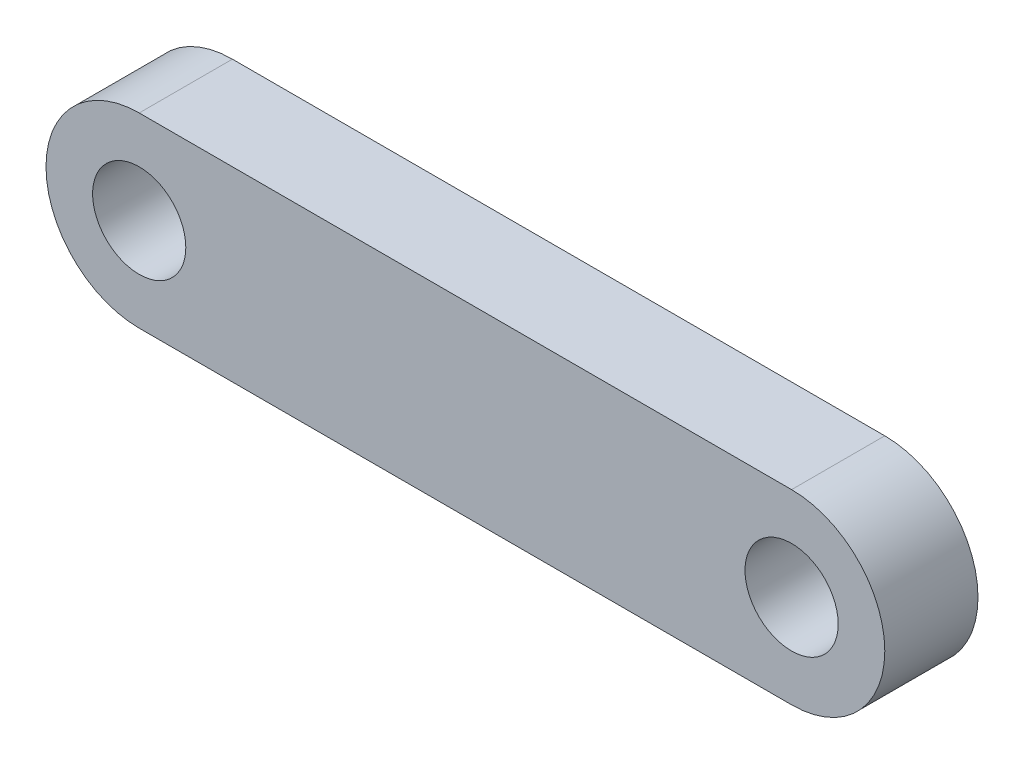
ISO-10303-21;
HEADER;
FILE_DESCRIPTION(('STEP AP214'),'2;1');
FILE_NAME('part.step','',(''),(''),'','','');
FILE_SCHEMA(('AUTOMOTIVE_DESIGN { 1 0 10303 214 1 1 1 1 }'));
ENDSEC;
DATA;
#1=APPLICATION_CONTEXT('core data for automotive mechanical design processes');
#2=APPLICATION_PROTOCOL_DEFINITION('international standard','automotive_design',2000,#1);
#3=PRODUCT_CONTEXT('',#1,'mechanical');
#4=PRODUCT('Part','Part','',(#3));
#5=PRODUCT_RELATED_PRODUCT_CATEGORY('part','',(#4));
#6=PRODUCT_DEFINITION_FORMATION('','',#4);
#7=PRODUCT_DEFINITION_CONTEXT('part definition',#1,'design');
#8=PRODUCT_DEFINITION('design','',#6,#7);
#9=PRODUCT_DEFINITION_SHAPE('','',#8);
#10=(LENGTH_UNIT() NAMED_UNIT(*) SI_UNIT(.MILLI.,.METRE.));
#11=(NAMED_UNIT(*) PLANE_ANGLE_UNIT() SI_UNIT($,.RADIAN.));
#12=(NAMED_UNIT(*) SI_UNIT($,.STERADIAN.) SOLID_ANGLE_UNIT());
#13=UNCERTAINTY_MEASURE_WITH_UNIT(LENGTH_MEASURE(1.E-05),#10,'distance_accuracy_value','');
#14=(GEOMETRIC_REPRESENTATION_CONTEXT(3) GLOBAL_UNCERTAINTY_ASSIGNED_CONTEXT((#13)) GLOBAL_UNIT_ASSIGNED_CONTEXT((#10,
#11,#12)) REPRESENTATION_CONTEXT('',''));
#15=CARTESIAN_POINT('',(0.,0.,0.));
#16=DIRECTION('',(0.,0.,1.));
#17=DIRECTION('',(1.,0.,0.));
#18=AXIS2_PLACEMENT_3D('',#15,#16,#17);
#19=CARTESIAN_POINT('',(0.,0.,10.));
#20=DIRECTION('',(0.,0.,-1.));
#21=DIRECTION('',(-1.,0.,0.));
#22=AXIS2_PLACEMENT_3D('',#19,#20,#21);
#23=CYLINDRICAL_SURFACE('',#22,10.);
#24=CARTESIAN_POINT('',(0.,0.,0.));
#25=DIRECTION('',(0.,0.,1.));
#26=DIRECTION('',(1.,0.,0.));
#27=AXIS2_PLACEMENT_3D('',#24,#25,#26);
#28=CIRCLE('',#27,10.);
#29=CARTESIAN_POINT('',(0.,10.,0.));
#30=VERTEX_POINT('',#29);
#31=CARTESIAN_POINT('',(0.,-10.,0.));
#32=VERTEX_POINT('',#31);
#33=EDGE_CURVE('E99',#30,#32,#28,.T.);
#34=ORIENTED_EDGE('',*,*,#33,.T.);
#35=DIRECTION('',(0.,0.,-1.));
#36=VECTOR('',#35,1.);
#37=CARTESIAN_POINT('',(0.,-10.,10.));
#38=LINE('',#37,#36);
#39=CARTESIAN_POINT('',(0.,-10.,10.));
#40=VERTEX_POINT('',#39);
#41=EDGE_CURVE('E11',#40,#32,#38,.T.);
#42=ORIENTED_EDGE('',*,*,#41,.F.);
#43=CARTESIAN_POINT('',(0.,0.,10.));
#44=DIRECTION('',(0.,0.,1.));
#45=DIRECTION('',(1.,0.,0.));
#46=AXIS2_PLACEMENT_3D('',#43,#44,#45);
#47=CIRCLE('',#46,10.);
#48=CARTESIAN_POINT('',(0.,10.,10.));
#49=VERTEX_POINT('',#48);
#50=EDGE_CURVE('E87',#49,#40,#47,.T.);
#51=ORIENTED_EDGE('',*,*,#50,.F.);
#52=DIRECTION('',(0.,0.,-1.));
#53=VECTOR('',#52,1.);
#54=CARTESIAN_POINT('',(0.,10.,10.));
#55=LINE('',#54,#53);
#56=EDGE_CURVE('E95',#49,#30,#55,.T.);
#57=ORIENTED_EDGE('',*,*,#56,.T.);
#58=EDGE_LOOP('',(#34,#42,#51,#57));
#59=FACE_BOUND('',#58,.T.);
#60=ADVANCED_FACE('F36',(#59),#23,.T.);
#61=CARTESIAN_POINT('',(0.,-10.,10.));
#62=DIRECTION('',(0.,1.,0.));
#63=DIRECTION('',(0.,0.,1.));
#64=AXIS2_PLACEMENT_3D('',#61,#62,#63);
#65=PLANE('',#64);
#66=DIRECTION('',(1.,0.,0.));
#67=VECTOR('',#66,1.);
#68=CARTESIAN_POINT('',(0.,-10.,0.));
#69=LINE('',#68,#67);
#70=CARTESIAN_POINT('',(70.,-10.,0.));
#71=VERTEX_POINT('',#70);
#72=EDGE_CURVE('E91',#32,#71,#69,.T.);
#73=ORIENTED_EDGE('',*,*,#72,.T.);
#74=DIRECTION('',(0.,0.,-1.));
#75=VECTOR('',#74,1.);
#76=CARTESIAN_POINT('',(70.,-10.,10.));
#77=LINE('',#76,#75);
#78=CARTESIAN_POINT('',(70.,-10.,10.));
#79=VERTEX_POINT('',#78);
#80=EDGE_CURVE('E44',#79,#71,#77,.T.);
#81=ORIENTED_EDGE('',*,*,#80,.F.);
#82=DIRECTION('',(1.,0.,0.));
#83=VECTOR('',#82,1.);
#84=CARTESIAN_POINT('',(0.,-10.,10.));
#85=LINE('',#84,#83);
#86=EDGE_CURVE('E82',#40,#79,#85,.T.);
#87=ORIENTED_EDGE('',*,*,#86,.F.);
#88=ORIENTED_EDGE('',*,*,#41,.T.);
#89=EDGE_LOOP('',(#73,#81,#87,#88));
#90=FACE_BOUND('',#89,.T.);
#91=ADVANCED_FACE('F90',(#90),#65,.F.);
#92=CARTESIAN_POINT('',(70.,0.,10.));
#93=DIRECTION('',(0.,0.,-1.));
#94=DIRECTION('',(-1.,0.,0.));
#95=AXIS2_PLACEMENT_3D('',#92,#93,#94);
#96=CYLINDRICAL_SURFACE('',#95,10.);
#97=CARTESIAN_POINT('',(70.,0.,0.));
#98=DIRECTION('',(0.,0.,1.));
#99=DIRECTION('',(-1.,0.,0.));
#100=AXIS2_PLACEMENT_3D('',#97,#98,#99);
#101=CIRCLE('',#100,10.);
#102=CARTESIAN_POINT('',(70.,10.,0.));
#103=VERTEX_POINT('',#102);
#104=EDGE_CURVE('E69',#71,#103,#101,.T.);
#105=ORIENTED_EDGE('',*,*,#104,.T.);
#106=DIRECTION('',(0.,0.,-1.));
#107=VECTOR('',#106,1.);
#108=CARTESIAN_POINT('',(70.,10.,10.));
#109=LINE('',#108,#107);
#110=CARTESIAN_POINT('',(70.,10.,10.));
#111=VERTEX_POINT('',#110);
#112=EDGE_CURVE('E92',#111,#103,#109,.T.);
#113=ORIENTED_EDGE('',*,*,#112,.F.);
#114=CARTESIAN_POINT('',(70.,0.,10.));
#115=DIRECTION('',(0.,0.,1.));
#116=DIRECTION('',(-1.,0.,0.));
#117=AXIS2_PLACEMENT_3D('',#114,#115,#116);
#118=CIRCLE('',#117,10.);
#119=EDGE_CURVE('E85',#79,#111,#118,.T.);
#120=ORIENTED_EDGE('',*,*,#119,.F.);
#121=ORIENTED_EDGE('',*,*,#80,.T.);
#122=EDGE_LOOP('',(#105,#113,#120,#121));
#123=FACE_BOUND('',#122,.T.);
#124=ADVANCED_FACE('F93',(#123),#96,.T.);
#125=CARTESIAN_POINT('',(0.,10.,10.));
#126=DIRECTION('',(0.,-1.,0.));
#127=DIRECTION('',(0.,0.,-1.));
#128=AXIS2_PLACEMENT_3D('',#125,#126,#127);
#129=PLANE('',#128);
#130=DIRECTION('',(-1.,0.,0.));
#131=VECTOR('',#130,1.);
#132=CARTESIAN_POINT('',(0.,10.,0.));
#133=LINE('',#132,#131);
#134=EDGE_CURVE('E75',#103,#30,#133,.T.);
#135=ORIENTED_EDGE('',*,*,#134,.T.);
#136=ORIENTED_EDGE('',*,*,#56,.F.);
#137=DIRECTION('',(-1.,0.,0.));
#138=VECTOR('',#137,1.);
#139=CARTESIAN_POINT('',(0.,10.,10.));
#140=LINE('',#139,#138);
#141=EDGE_CURVE('E52',#111,#49,#140,.T.);
#142=ORIENTED_EDGE('',*,*,#141,.F.);
#143=ORIENTED_EDGE('',*,*,#112,.T.);
#144=EDGE_LOOP('',(#135,#136,#142,#143));
#145=FACE_BOUND('',#144,.T.);
#146=ADVANCED_FACE('F107',(#145),#129,.F.);
#147=CARTESIAN_POINT('',(0.,0.,10.));
#148=DIRECTION('',(0.,0.,1.));
#149=DIRECTION('',(1.,0.,0.));
#150=AXIS2_PLACEMENT_3D('',#147,#148,#149);
#151=PLANE('',#150);
#152=CARTESIAN_POINT('',(70.,0.,10.));
#153=DIRECTION('',(0.,0.,1.));
#154=DIRECTION('',(1.,0.,0.));
#155=AXIS2_PLACEMENT_3D('',#152,#153,#154);
#156=CIRCLE('',#155,5.);
#157=CARTESIAN_POINT('',(75.,0.,10.));
#158=VERTEX_POINT('',#157);
#159=EDGE_CURVE('E119',#158,#158,#156,.T.);
#160=ORIENTED_EDGE('',*,*,#159,.F.);
#161=EDGE_LOOP('',(#160));
#162=FACE_BOUND('',#161,.T.);
#163=CARTESIAN_POINT('',(0.,0.,10.));
#164=DIRECTION('',(0.,0.,1.));
#165=DIRECTION('',(1.,0.,0.));
#166=AXIS2_PLACEMENT_3D('',#163,#164,#165);
#167=CIRCLE('',#166,5.);
#168=CARTESIAN_POINT('',(5.,0.,10.));
#169=VERTEX_POINT('',#168);
#170=EDGE_CURVE('E113',#169,#169,#167,.T.);
#171=ORIENTED_EDGE('',*,*,#170,.F.);
#172=EDGE_LOOP('',(#171));
#173=FACE_BOUND('',#172,.T.);
#174=ORIENTED_EDGE('',*,*,#50,.T.);
#175=ORIENTED_EDGE('',*,*,#86,.T.);
#176=ORIENTED_EDGE('',*,*,#119,.T.);
#177=ORIENTED_EDGE('',*,*,#141,.T.);
#178=EDGE_LOOP('',(#174,#175,#176,#177));
#179=FACE_BOUND('',#178,.T.);
#180=ADVANCED_FACE('F83',(#162,#173,#179),#151,.T.);
#181=CARTESIAN_POINT('',(0.,0.,0.));
#182=DIRECTION('',(0.,0.,1.));
#183=DIRECTION('',(1.,0.,0.));
#184=AXIS2_PLACEMENT_3D('',#181,#182,#183);
#185=PLANE('',#184);
#186=CARTESIAN_POINT('',(70.,0.,0.));
#187=DIRECTION('',(0.,0.,1.));
#188=DIRECTION('',(1.,0.,0.));
#189=AXIS2_PLACEMENT_3D('',#186,#187,#188);
#190=CIRCLE('',#189,5.);
#191=CARTESIAN_POINT('',(75.,0.,0.));
#192=VERTEX_POINT('',#191);
#193=EDGE_CURVE('E116',#192,#192,#190,.T.);
#194=ORIENTED_EDGE('',*,*,#193,.T.);
#195=EDGE_LOOP('',(#194));
#196=FACE_BOUND('',#195,.T.);
#197=CARTESIAN_POINT('',(0.,0.,0.));
#198=DIRECTION('',(0.,0.,1.));
#199=DIRECTION('',(1.,0.,0.));
#200=AXIS2_PLACEMENT_3D('',#197,#198,#199);
#201=CIRCLE('',#200,5.);
#202=CARTESIAN_POINT('',(5.,0.,0.));
#203=VERTEX_POINT('',#202);
#204=EDGE_CURVE('E102',#203,#203,#201,.T.);
#205=ORIENTED_EDGE('',*,*,#204,.T.);
#206=EDGE_LOOP('',(#205));
#207=FACE_BOUND('',#206,.T.);
#208=ORIENTED_EDGE('',*,*,#33,.F.);
#209=ORIENTED_EDGE('',*,*,#134,.F.);
#210=ORIENTED_EDGE('',*,*,#104,.F.);
#211=ORIENTED_EDGE('',*,*,#72,.F.);
#212=EDGE_LOOP('',(#208,#209,#210,#211));
#213=FACE_BOUND('',#212,.T.);
#214=ADVANCED_FACE('F110',(#196,#207,#213),#185,.F.);
#215=CARTESIAN_POINT('',(0.,0.,0.));
#216=DIRECTION('',(0.,0.,1.));
#217=DIRECTION('',(1.,0.,0.));
#218=AXIS2_PLACEMENT_3D('',#215,#216,#217);
#219=CYLINDRICAL_SURFACE('',#218,5.);
#220=ORIENTED_EDGE('',*,*,#204,.F.);
#221=EDGE_LOOP('',(#220));
#222=FACE_BOUND('',#221,.T.);
#223=ORIENTED_EDGE('',*,*,#170,.T.);
#224=EDGE_LOOP('',(#223));
#225=FACE_BOUND('',#224,.T.);
#226=ADVANCED_FACE('F130',(#222,#225),#219,.F.);
#227=CARTESIAN_POINT('',(70.,0.,0.));
#228=DIRECTION('',(0.,0.,1.));
#229=DIRECTION('',(1.,0.,0.));
#230=AXIS2_PLACEMENT_3D('',#227,#228,#229);
#231=CYLINDRICAL_SURFACE('',#230,5.);
#232=ORIENTED_EDGE('',*,*,#193,.F.);
#233=EDGE_LOOP('',(#232));
#234=FACE_BOUND('',#233,.T.);
#235=ORIENTED_EDGE('',*,*,#159,.T.);
#236=EDGE_LOOP('',(#235));
#237=FACE_BOUND('',#236,.T.);
#238=ADVANCED_FACE('F127',(#234,#237),#231,.F.);
#239=CLOSED_SHELL('',(#60,#91,#124,#146,#180,#214,#226,#238));
#240=MANIFOLD_SOLID_BREP('B2',#239);
#241=ADVANCED_BREP_SHAPE_REPRESENTATION('',(#18,#240),#14);
#242=SHAPE_DEFINITION_REPRESENTATION(#9,#241);
ENDSEC;
END-ISO-10303-21;
